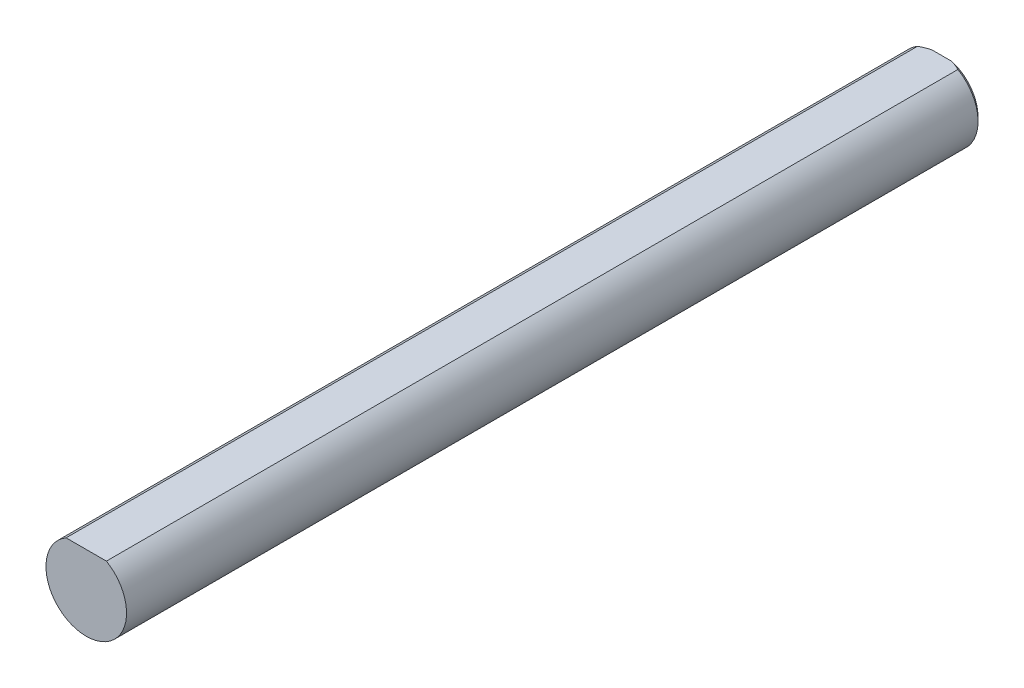
ISO-10303-21;
HEADER;
FILE_DESCRIPTION(('STEP AP214'),'2;1');
FILE_NAME('part.step','',(''),(''),'','','');
FILE_SCHEMA(('AUTOMOTIVE_DESIGN { 1 0 10303 214 1 1 1 1 }'));
ENDSEC;
DATA;
#1=APPLICATION_CONTEXT('core data for automotive mechanical design processes');
#2=APPLICATION_PROTOCOL_DEFINITION('international standard','automotive_design',2000,#1);
#3=PRODUCT_CONTEXT('',#1,'mechanical');
#4=PRODUCT('Part','Part','',(#3));
#5=PRODUCT_RELATED_PRODUCT_CATEGORY('part','',(#4));
#6=PRODUCT_DEFINITION_FORMATION('','',#4);
#7=PRODUCT_DEFINITION_CONTEXT('part definition',#1,'design');
#8=PRODUCT_DEFINITION('design','',#6,#7);
#9=PRODUCT_DEFINITION_SHAPE('','',#8);
#10=(LENGTH_UNIT() NAMED_UNIT(*) SI_UNIT(.MILLI.,.METRE.));
#11=(NAMED_UNIT(*) PLANE_ANGLE_UNIT() SI_UNIT($,.RADIAN.));
#12=(NAMED_UNIT(*) SI_UNIT($,.STERADIAN.) SOLID_ANGLE_UNIT());
#13=UNCERTAINTY_MEASURE_WITH_UNIT(LENGTH_MEASURE(1.E-05),#10,'distance_accuracy_value','');
#14=(GEOMETRIC_REPRESENTATION_CONTEXT(3) GLOBAL_UNCERTAINTY_ASSIGNED_CONTEXT((#13)) GLOBAL_UNIT_ASSIGNED_CONTEXT((#10,
#11,#12)) REPRESENTATION_CONTEXT('',''));
#15=CARTESIAN_POINT('',(0.,0.,0.));
#16=DIRECTION('',(0.,0.,1.));
#17=DIRECTION('',(1.,0.,0.));
#18=AXIS2_PLACEMENT_3D('',#15,#16,#17);
#19=CARTESIAN_POINT('',(0.,0.,76.2));
#20=DIRECTION('',(0.,0.,-1.));
#21=DIRECTION('',(-1.,0.,0.));
#22=AXIS2_PLACEMENT_3D('',#19,#20,#21);
#23=CYLINDRICAL_SURFACE('',#22,3.175);
#24=DIRECTION('',(0.,0.,1.));
#25=VECTOR('',#24,1.);
#26=CARTESIAN_POINT('',(1.5875,2.74963065701559,-76.2));
#27=LINE('',#26,#25);
#28=CARTESIAN_POINT('',(1.5875,2.74963065701559,-75.8824999999998));
#29=VERTEX_POINT('',#28);
#30=CARTESIAN_POINT('',(1.5875,2.74963065701559,-8.80000000000003));
#31=VERTEX_POINT('',#30);
#32=EDGE_CURVE('E80',#29,#31,#27,.T.);
#33=ORIENTED_EDGE('',*,*,#32,.T.);
#34=CARTESIAN_POINT('',(0.,0.,-8.8));
#35=DIRECTION('',(0.,0.,-1.));
#36=DIRECTION('',(-1.,0.,0.));
#37=AXIS2_PLACEMENT_3D('',#34,#35,#36);
#38=CIRCLE('',#37,3.175);
#39=CARTESIAN_POINT('',(-1.5875,2.74963065701559,-8.8));
#40=VERTEX_POINT('',#39);
#41=EDGE_CURVE('E54',#31,#40,#38,.T.);
#42=ORIENTED_EDGE('',*,*,#41,.T.);
#43=DIRECTION('',(0.,0.,1.));
#44=VECTOR('',#43,1.);
#45=CARTESIAN_POINT('',(-1.5875,2.74963065701559,-76.2));
#46=LINE('',#45,#44);
#47=CARTESIAN_POINT('',(-1.5875,2.74963065701559,-75.8824999999998));
#48=VERTEX_POINT('',#47);
#49=EDGE_CURVE('E78',#48,#40,#46,.T.);
#50=ORIENTED_EDGE('',*,*,#49,.F.);
#51=CARTESIAN_POINT('',(0.,0.,-75.8824999999998));
#52=DIRECTION('',(0.,0.,1.));
#53=DIRECTION('',(1.,0.,0.));
#54=AXIS2_PLACEMENT_3D('',#51,#52,#53);
#55=CIRCLE('',#54,3.175);
#56=EDGE_CURVE('E87',#48,#29,#55,.T.);
#57=ORIENTED_EDGE('',*,*,#56,.T.);
#58=EDGE_LOOP('',(#33,#42,#50,#57));
#59=FACE_BOUND('',#58,.T.);
#60=ADVANCED_FACE('F39',(#59),#23,.T.);
#61=CARTESIAN_POINT('',(0.,0.,-76.2));
#62=DIRECTION('',(0.,0.,1.));
#63=DIRECTION('',(1.,0.,0.));
#64=AXIS2_PLACEMENT_3D('',#61,#62,#63);
#65=PLANE('',#64);
#66=DIRECTION('',(1.,0.,0.));
#67=VECTOR('',#66,1.);
#68=CARTESIAN_POINT('',(-1.5875,2.74963065701559,-76.2));
#69=LINE('',#68,#67);
#70=CARTESIAN_POINT('',(-0.77771299333294,2.74963065701559,-76.2));
#71=VERTEX_POINT('',#70);
#72=CARTESIAN_POINT('',(0.77771299333294,2.74963065701559,-76.2));
#73=VERTEX_POINT('',#72);
#74=EDGE_CURVE('E81',#71,#73,#69,.T.);
#75=ORIENTED_EDGE('',*,*,#74,.T.);
#76=CARTESIAN_POINT('',(0.,0.,-76.2));
#77=DIRECTION('',(0.,0.,1.));
#78=DIRECTION('',(1.,0.,0.));
#79=AXIS2_PLACEMENT_3D('',#76,#77,#78);
#80=CIRCLE('',#79,2.8574999999998);
#81=EDGE_CURVE('E48',#73,#71,#80,.F.);
#82=ORIENTED_EDGE('',*,*,#81,.T.);
#83=EDGE_LOOP('',(#75,#82));
#84=FACE_BOUND('',#83,.T.);
#85=ADVANCED_FACE('F106',(#84),#65,.F.);
#86=CARTESIAN_POINT('',(-1.5875,2.74963065701559,-76.2));
#87=DIRECTION('',(0.,-1.,0.));
#88=DIRECTION('',(0.,0.,-1.));
#89=AXIS2_PLACEMENT_3D('',#86,#87,#88);
#90=PLANE('',#89);
#91=ORIENTED_EDGE('',*,*,#49,.T.);
#92=DIRECTION('',(1.,0.,0.));
#93=VECTOR('',#92,1.);
#94=CARTESIAN_POINT('',(-1.5875,2.74963065701559,-8.8));
#95=LINE('',#94,#93);
#96=EDGE_CURVE('E11',#40,#31,#95,.T.);
#97=ORIENTED_EDGE('',*,*,#96,.T.);
#98=ORIENTED_EDGE('',*,*,#32,.F.);
#99=CARTESIAN_POINT('',(1.5875,2.74963065701559,-75.8824999999998));
#100=CARTESIAN_POINT('',(1.52250516699264,2.74963065701559,-75.9149880824797));
#101=CARTESIAN_POINT('',(1.45690188238018,2.74963065701559,-75.9463019076192));
#102=CARTESIAN_POINT('',(1.32458227076999,2.74963065701559,-76.0060258514251));
#103=CARTESIAN_POINT('',(1.25786903887704,2.74963065701559,-76.0344428470168));
#104=CARTESIAN_POINT('',(1.12308918002457,2.74963065701559,-76.0879920057044));
#105=CARTESIAN_POINT('',(1.05502199036131,2.74963065701559,-76.1131227687341));
#106=CARTESIAN_POINT('',(0.917422256787398,2.74963065701559,-76.1595821959476));
#107=CARTESIAN_POINT('',(0.84788654327487,2.74963065701559,-76.1809014355307));
#108=CARTESIAN_POINT('',(0.777712993332939,2.74963065701559,-76.2));
#109=B_SPLINE_CURVE_WITH_KNOTS('',3,(#99,#100,#101,#102,#103,#104,#105,#106,#107,#108),
.UNSPECIFIED.,.F.,.F.,(4,2,2,2,4),(0.,0.218002568777967,0.435474929897523,0.653039643131099,
0.871135095681305),.UNSPECIFIED.);
#110=EDGE_CURVE('E61',#29,#73,#109,.T.);
#111=ORIENTED_EDGE('',*,*,#110,.T.);
#112=ORIENTED_EDGE('',*,*,#74,.F.);
#113=CARTESIAN_POINT('',(-0.77771299333294,2.74963065701559,-76.2));
#114=CARTESIAN_POINT('',(-0.847886543274871,2.74963065701559,-76.1809014355307));
#115=CARTESIAN_POINT('',(-0.917422256787399,2.74963065701559,-76.1595821959476));
#116=CARTESIAN_POINT('',(-1.05502199036131,2.74963065701559,-76.1131227687341));
#117=CARTESIAN_POINT('',(-1.12308918002457,2.74963065701559,-76.0879920057044));
#118=CARTESIAN_POINT('',(-1.25786903887704,2.74963065701559,-76.0344428470168));
#119=CARTESIAN_POINT('',(-1.32458227076999,2.74963065701559,-76.0060258514251));
#120=CARTESIAN_POINT('',(-1.45690188238018,2.74963065701559,-75.9463019076192));
#121=CARTESIAN_POINT('',(-1.52250516699264,2.74963065701559,-75.9149880824797));
#122=CARTESIAN_POINT('',(-1.5875,2.74963065701559,-75.8824999999998));
#123=B_SPLINE_CURVE_WITH_KNOTS('',3,(#113,#114,#115,#116,#117,#118,#119,#120,#121,#122),
.UNSPECIFIED.,.F.,.F.,(4,2,2,2,4),(0.,0.218095452550206,0.435660165783782,0.653132526903341,
0.871135095681305),.UNSPECIFIED.);
#124=EDGE_CURVE('E85',#71,#48,#123,.T.);
#125=ORIENTED_EDGE('',*,*,#124,.T.);
#126=EDGE_LOOP('',(#91,#97,#98,#111,#112,#125));
#127=FACE_BOUND('',#126,.T.);
#128=ADVANCED_FACE('F83',(#127),#90,.F.);
#129=CARTESIAN_POINT('',(0.,0.,-75.8824999999998));
#130=DIRECTION('',(0.,0.,1.));
#131=DIRECTION('',(1.,0.,0.));
#132=AXIS2_PLACEMENT_3D('',#129,#130,#131);
#133=CONICAL_SURFACE('',#132,3.175,0.785398163397453);
#134=ORIENTED_EDGE('',*,*,#124,.F.);
#135=ORIENTED_EDGE('',*,*,#81,.F.);
#136=ORIENTED_EDGE('',*,*,#110,.F.);
#137=ORIENTED_EDGE('',*,*,#56,.F.);
#138=EDGE_LOOP('',(#134,#135,#136,#137));
#139=FACE_BOUND('',#138,.T.);
#140=ADVANCED_FACE('F41',(#139),#133,.T.);
#141=CARTESIAN_POINT('',(0.,0.,-8.8));
#142=DIRECTION('',(0.,0.,-1.));
#143=DIRECTION('',(-1.,0.,0.));
#144=AXIS2_PLACEMENT_3D('',#141,#142,#143);
#145=PLANE('',#144);
#146=ORIENTED_EDGE('',*,*,#96,.F.);
#147=ORIENTED_EDGE('',*,*,#41,.F.);
#148=EDGE_LOOP('',(#146,#147));
#149=FACE_BOUND('',#148,.T.);
#150=ADVANCED_FACE('F72',(#149),#145,.F.);
#151=CLOSED_SHELL('',(#60,#85,#128,#140,#150));
#152=MANIFOLD_SOLID_BREP('B2',#151);
#153=ADVANCED_BREP_SHAPE_REPRESENTATION('',(#18,#152),#14);
#154=SHAPE_DEFINITION_REPRESENTATION(#9,#153);
ENDSEC;
END-ISO-10303-21;
